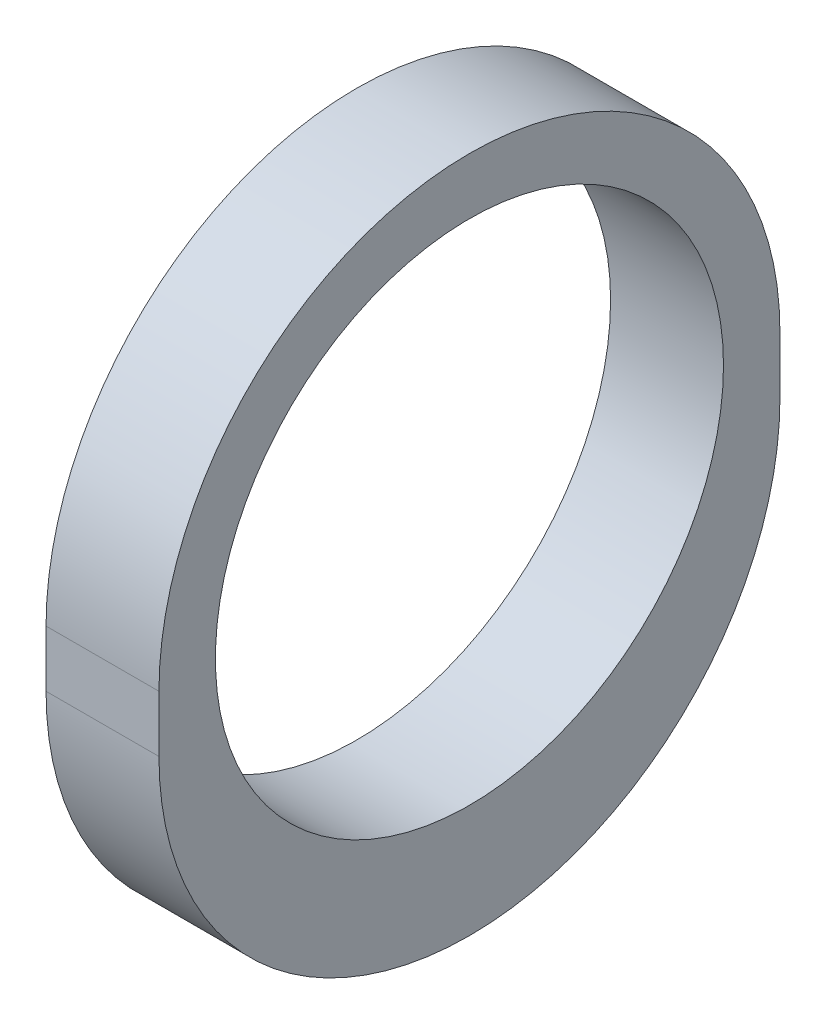
ISO-10303-21;
HEADER;
FILE_DESCRIPTION(('STEP AP214'),'2;1');
FILE_NAME('part.step','',(''),(''),'','','');
FILE_SCHEMA(('AUTOMOTIVE_DESIGN { 1 0 10303 214 1 1 1 1 }'));
ENDSEC;
DATA;
#1=APPLICATION_CONTEXT('core data for automotive mechanical design processes');
#2=APPLICATION_PROTOCOL_DEFINITION('international standard','automotive_design',2000,#1);
#3=PRODUCT_CONTEXT('',#1,'mechanical');
#4=PRODUCT('Part','Part','',(#3));
#5=PRODUCT_RELATED_PRODUCT_CATEGORY('part','',(#4));
#6=PRODUCT_DEFINITION_FORMATION('','',#4);
#7=PRODUCT_DEFINITION_CONTEXT('part definition',#1,'design');
#8=PRODUCT_DEFINITION('design','',#6,#7);
#9=PRODUCT_DEFINITION_SHAPE('','',#8);
#10=(LENGTH_UNIT() NAMED_UNIT(*) SI_UNIT(.MILLI.,.METRE.));
#11=(NAMED_UNIT(*) PLANE_ANGLE_UNIT() SI_UNIT($,.RADIAN.));
#12=(NAMED_UNIT(*) SI_UNIT($,.STERADIAN.) SOLID_ANGLE_UNIT());
#13=UNCERTAINTY_MEASURE_WITH_UNIT(LENGTH_MEASURE(1.E-05),#10,'distance_accuracy_value','');
#14=(GEOMETRIC_REPRESENTATION_CONTEXT(3) GLOBAL_UNCERTAINTY_ASSIGNED_CONTEXT((#13)) GLOBAL_UNIT_ASSIGNED_CONTEXT((#10,
#11,#12)) REPRESENTATION_CONTEXT('',''));
#15=CARTESIAN_POINT('',(0.,0.,0.));
#16=DIRECTION('',(0.,0.,1.));
#17=DIRECTION('',(1.,0.,0.));
#18=AXIS2_PLACEMENT_3D('',#15,#16,#17);
#19=CARTESIAN_POINT('',(2.,0.,0.));
#20=DIRECTION('',(1.,0.,0.));
#21=DIRECTION('',(0.,0.,-1.));
#22=AXIS2_PLACEMENT_3D('',#19,#20,#21);
#23=PLANE('',#22);
#24=CARTESIAN_POINT('',(2.,0.,0.));
#25=DIRECTION('',(1.,0.,0.));
#26=DIRECTION('',(0.,0.,-1.));
#27=AXIS2_PLACEMENT_3D('',#24,#25,#26);
#28=CIRCLE('',#27,11.);
#29=CARTESIAN_POINT('',(2.,0.,-11.));
#30=VERTEX_POINT('',#29);
#31=CARTESIAN_POINT('',(2.,0.,11.));
#32=VERTEX_POINT('',#31);
#33=EDGE_CURVE('E84',#30,#32,#28,.T.);
#34=ORIENTED_EDGE('',*,*,#33,.T.);
#35=DIRECTION('',(0.,-1.,0.));
#36=VECTOR('',#35,1.);
#37=CARTESIAN_POINT('',(2.,0.,11.));
#38=LINE('',#37,#36);
#39=CARTESIAN_POINT('',(2.,-2.,11.));
#40=VERTEX_POINT('',#39);
#41=EDGE_CURVE('E79',#32,#40,#38,.T.);
#42=ORIENTED_EDGE('',*,*,#41,.T.);
#43=CARTESIAN_POINT('',(2.,-2.,0.));
#44=DIRECTION('',(1.,0.,0.));
#45=DIRECTION('',(0.,0.,-1.));
#46=AXIS2_PLACEMENT_3D('',#43,#44,#45);
#47=CIRCLE('',#46,11.);
#48=CARTESIAN_POINT('',(2.,-2.,-11.));
#49=VERTEX_POINT('',#48);
#50=EDGE_CURVE('E82',#40,#49,#47,.T.);
#51=ORIENTED_EDGE('',*,*,#50,.T.);
#52=DIRECTION('',(0.,1.,0.));
#53=VECTOR('',#52,1.);
#54=CARTESIAN_POINT('',(2.,0.,-11.));
#55=LINE('',#54,#53);
#56=EDGE_CURVE('E49',#49,#30,#55,.T.);
#57=ORIENTED_EDGE('',*,*,#56,.T.);
#58=EDGE_LOOP('',(#34,#42,#51,#57));
#59=FACE_BOUND('',#58,.T.);
#60=CARTESIAN_POINT('',(2.,0.,0.));
#61=DIRECTION('',(1.,0.,0.));
#62=DIRECTION('',(0.,0.,-1.));
#63=AXIS2_PLACEMENT_3D('',#60,#61,#62);
#64=CIRCLE('',#63,9.);
#65=CARTESIAN_POINT('',(2.,0.,-9.));
#66=VERTEX_POINT('',#65);
#67=EDGE_CURVE('E99',#66,#66,#64,.T.);
#68=ORIENTED_EDGE('',*,*,#67,.F.);
#69=EDGE_LOOP('',(#68));
#70=FACE_BOUND('',#69,.T.);
#71=ADVANCED_FACE('F32',(#59,#70),#23,.T.);
#72=CARTESIAN_POINT('',(-2.,0.,0.));
#73=DIRECTION('',(1.,0.,0.));
#74=DIRECTION('',(0.,0.,-1.));
#75=AXIS2_PLACEMENT_3D('',#72,#73,#74);
#76=PLANE('',#75);
#77=CARTESIAN_POINT('',(-2.,0.,0.));
#78=DIRECTION('',(1.,0.,0.));
#79=DIRECTION('',(0.,0.,-1.));
#80=AXIS2_PLACEMENT_3D('',#77,#78,#79);
#81=CIRCLE('',#80,11.);
#82=CARTESIAN_POINT('',(-2.,0.,-11.));
#83=VERTEX_POINT('',#82);
#84=CARTESIAN_POINT('',(-2.,0.,11.));
#85=VERTEX_POINT('',#84);
#86=EDGE_CURVE('E96',#83,#85,#81,.T.);
#87=ORIENTED_EDGE('',*,*,#86,.F.);
#88=DIRECTION('',(0.,1.,0.));
#89=VECTOR('',#88,1.);
#90=CARTESIAN_POINT('',(-2.,0.,-11.));
#91=LINE('',#90,#89);
#92=CARTESIAN_POINT('',(-2.,-2.,-11.));
#93=VERTEX_POINT('',#92);
#94=EDGE_CURVE('E72',#93,#83,#91,.T.);
#95=ORIENTED_EDGE('',*,*,#94,.F.);
#96=CARTESIAN_POINT('',(-2.,-2.,0.));
#97=DIRECTION('',(1.,0.,0.));
#98=DIRECTION('',(0.,0.,-1.));
#99=AXIS2_PLACEMENT_3D('',#96,#97,#98);
#100=CIRCLE('',#99,11.);
#101=CARTESIAN_POINT('',(-2.,-2.,11.));
#102=VERTEX_POINT('',#101);
#103=EDGE_CURVE('E66',#102,#93,#100,.T.);
#104=ORIENTED_EDGE('',*,*,#103,.F.);
#105=DIRECTION('',(0.,-1.,0.));
#106=VECTOR('',#105,1.);
#107=CARTESIAN_POINT('',(-2.,0.,11.));
#108=LINE('',#107,#106);
#109=EDGE_CURVE('E88',#85,#102,#108,.T.);
#110=ORIENTED_EDGE('',*,*,#109,.F.);
#111=EDGE_LOOP('',(#87,#95,#104,#110));
#112=FACE_BOUND('',#111,.T.);
#113=CARTESIAN_POINT('',(-2.,0.,0.));
#114=DIRECTION('',(1.,0.,0.));
#115=DIRECTION('',(0.,0.,-1.));
#116=AXIS2_PLACEMENT_3D('',#113,#114,#115);
#117=CIRCLE('',#116,9.);
#118=CARTESIAN_POINT('',(-2.,0.,-9.));
#119=VERTEX_POINT('',#118);
#120=EDGE_CURVE('E111',#119,#119,#117,.T.);
#121=ORIENTED_EDGE('',*,*,#120,.T.);
#122=EDGE_LOOP('',(#121));
#123=FACE_BOUND('',#122,.T.);
#124=ADVANCED_FACE('F107',(#112,#123),#76,.F.);
#125=CARTESIAN_POINT('',(2.,0.,0.));
#126=DIRECTION('',(-1.,0.,0.));
#127=DIRECTION('',(0.,0.,1.));
#128=AXIS2_PLACEMENT_3D('',#125,#126,#127);
#129=CYLINDRICAL_SURFACE('',#128,11.);
#130=ORIENTED_EDGE('',*,*,#86,.T.);
#131=DIRECTION('',(-1.,0.,0.));
#132=VECTOR('',#131,1.);
#133=CARTESIAN_POINT('',(2.,0.,11.));
#134=LINE('',#133,#132);
#135=EDGE_CURVE('E11',#32,#85,#134,.T.);
#136=ORIENTED_EDGE('',*,*,#135,.F.);
#137=ORIENTED_EDGE('',*,*,#33,.F.);
#138=DIRECTION('',(-1.,0.,0.));
#139=VECTOR('',#138,1.);
#140=CARTESIAN_POINT('',(2.,0.,-11.));
#141=LINE('',#140,#139);
#142=EDGE_CURVE('E92',#30,#83,#141,.T.);
#143=ORIENTED_EDGE('',*,*,#142,.T.);
#144=EDGE_LOOP('',(#130,#136,#137,#143));
#145=FACE_BOUND('',#144,.T.);
#146=ADVANCED_FACE('F34',(#145),#129,.T.);
#147=CARTESIAN_POINT('',(2.,0.,11.));
#148=DIRECTION('',(0.,0.,-1.));
#149=DIRECTION('',(-1.,0.,0.));
#150=AXIS2_PLACEMENT_3D('',#147,#148,#149);
#151=PLANE('',#150);
#152=ORIENTED_EDGE('',*,*,#109,.T.);
#153=DIRECTION('',(-1.,0.,0.));
#154=VECTOR('',#153,1.);
#155=CARTESIAN_POINT('',(2.,-2.,11.));
#156=LINE('',#155,#154);
#157=EDGE_CURVE('E41',#40,#102,#156,.T.);
#158=ORIENTED_EDGE('',*,*,#157,.F.);
#159=ORIENTED_EDGE('',*,*,#41,.F.);
#160=ORIENTED_EDGE('',*,*,#135,.T.);
#161=EDGE_LOOP('',(#152,#158,#159,#160));
#162=FACE_BOUND('',#161,.T.);
#163=ADVANCED_FACE('F87',(#162),#151,.F.);
#164=CARTESIAN_POINT('',(2.,-2.,0.));
#165=DIRECTION('',(-1.,0.,0.));
#166=DIRECTION('',(0.,0.,1.));
#167=AXIS2_PLACEMENT_3D('',#164,#165,#166);
#168=CYLINDRICAL_SURFACE('',#167,11.);
#169=ORIENTED_EDGE('',*,*,#103,.T.);
#170=DIRECTION('',(-1.,0.,0.));
#171=VECTOR('',#170,1.);
#172=CARTESIAN_POINT('',(2.,-2.,-11.));
#173=LINE('',#172,#171);
#174=EDGE_CURVE('E89',#49,#93,#173,.T.);
#175=ORIENTED_EDGE('',*,*,#174,.F.);
#176=ORIENTED_EDGE('',*,*,#50,.F.);
#177=ORIENTED_EDGE('',*,*,#157,.T.);
#178=EDGE_LOOP('',(#169,#175,#176,#177));
#179=FACE_BOUND('',#178,.T.);
#180=ADVANCED_FACE('F90',(#179),#168,.T.);
#181=CARTESIAN_POINT('',(2.,0.,-11.));
#182=DIRECTION('',(0.,0.,1.));
#183=DIRECTION('',(1.,0.,0.));
#184=AXIS2_PLACEMENT_3D('',#181,#182,#183);
#185=PLANE('',#184);
#186=ORIENTED_EDGE('',*,*,#94,.T.);
#187=ORIENTED_EDGE('',*,*,#142,.F.);
#188=ORIENTED_EDGE('',*,*,#56,.F.);
#189=ORIENTED_EDGE('',*,*,#174,.T.);
#190=EDGE_LOOP('',(#186,#187,#188,#189));
#191=FACE_BOUND('',#190,.T.);
#192=ADVANCED_FACE('F104',(#191),#185,.F.);
#193=CARTESIAN_POINT('',(2.,0.,0.));
#194=DIRECTION('',(-1.,0.,0.));
#195=DIRECTION('',(0.,0.,1.));
#196=AXIS2_PLACEMENT_3D('',#193,#194,#195);
#197=CYLINDRICAL_SURFACE('',#196,9.);
#198=ORIENTED_EDGE('',*,*,#67,.T.);
#199=EDGE_LOOP('',(#198));
#200=FACE_BOUND('',#199,.T.);
#201=ORIENTED_EDGE('',*,*,#120,.F.);
#202=EDGE_LOOP('',(#201));
#203=FACE_BOUND('',#202,.T.);
#204=ADVANCED_FACE('F117',(#200,#203),#197,.F.);
#205=CLOSED_SHELL('',(#71,#124,#146,#163,#180,#192,#204));
#206=MANIFOLD_SOLID_BREP('B2',#205);
#207=ADVANCED_BREP_SHAPE_REPRESENTATION('',(#18,#206),#14);
#208=SHAPE_DEFINITION_REPRESENTATION(#9,#207);
ENDSEC;
END-ISO-10303-21;
